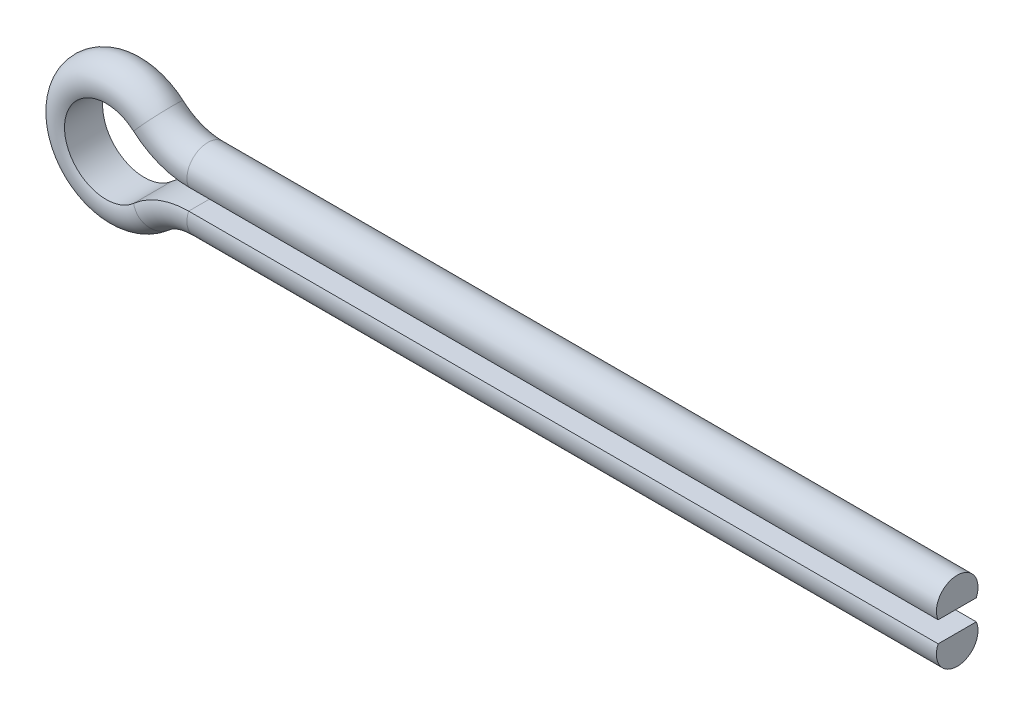
ISO-10303-21;
HEADER;
FILE_DESCRIPTION(('STEP AP214'),'2;1');
FILE_NAME('part.step','',(''),(''),'','','');
FILE_SCHEMA(('AUTOMOTIVE_DESIGN { 1 0 10303 214 1 1 1 1 }'));
ENDSEC;
DATA;
#1=APPLICATION_CONTEXT('core data for automotive mechanical design processes');
#2=APPLICATION_PROTOCOL_DEFINITION('international standard','automotive_design',2000,#1);
#3=PRODUCT_CONTEXT('',#1,'mechanical');
#4=PRODUCT('Part','Part','',(#3));
#5=PRODUCT_RELATED_PRODUCT_CATEGORY('part','',(#4));
#6=PRODUCT_DEFINITION_FORMATION('','',#4);
#7=PRODUCT_DEFINITION_CONTEXT('part definition',#1,'design');
#8=PRODUCT_DEFINITION('design','',#6,#7);
#9=PRODUCT_DEFINITION_SHAPE('','',#8);
#10=(LENGTH_UNIT() NAMED_UNIT(*) SI_UNIT(.MILLI.,.METRE.));
#11=(NAMED_UNIT(*) PLANE_ANGLE_UNIT() SI_UNIT($,.RADIAN.));
#12=(NAMED_UNIT(*) SI_UNIT($,.STERADIAN.) SOLID_ANGLE_UNIT());
#13=UNCERTAINTY_MEASURE_WITH_UNIT(LENGTH_MEASURE(1.E-05),#10,'distance_accuracy_value','');
#14=(GEOMETRIC_REPRESENTATION_CONTEXT(3) GLOBAL_UNCERTAINTY_ASSIGNED_CONTEXT((#13)) GLOBAL_UNIT_ASSIGNED_CONTEXT((#10,
#11,#12)) REPRESENTATION_CONTEXT('',''));
#15=CARTESIAN_POINT('',(0.,0.,0.));
#16=DIRECTION('',(0.,0.,1.));
#17=DIRECTION('',(1.,0.,0.));
#18=AXIS2_PLACEMENT_3D('',#15,#16,#17);
#19=CARTESIAN_POINT('',(100.,-2.25,0.));
#20=DIRECTION('',(-1.,0.,0.));
#21=DIRECTION('',(0.,-1.,0.));
#22=AXIS2_PLACEMENT_3D('',#19,#20,#21);
#23=PLANE('',#22);
#24=CARTESIAN_POINT('',(100.,-2.25,0.));
#25=DIRECTION('',(-1.,0.,0.));
#26=DIRECTION('',(0.,-1.,0.));
#27=AXIS2_PLACEMENT_3D('',#24,#25,#26);
#28=CIRCLE('',#27,2.5);
#29=CARTESIAN_POINT('',(100.,-1.25,-2.29128784747792));
#30=VERTEX_POINT('',#29);
#31=CARTESIAN_POINT('',(100.,-1.25,2.29128784747792));
#32=VERTEX_POINT('',#31);
#33=EDGE_CURVE('E79',#30,#32,#28,.T.);
#34=ORIENTED_EDGE('',*,*,#33,.F.);
#35=DIRECTION('',(0.,0.,-1.));
#36=VECTOR('',#35,1.);
#37=CARTESIAN_POINT('',(100.,-1.25,2.29128784747792));
#38=LINE('',#37,#36);
#39=EDGE_CURVE('E81',#32,#30,#38,.T.);
#40=ORIENTED_EDGE('',*,*,#39,.F.);
#41=EDGE_LOOP('',(#34,#40));
#42=FACE_BOUND('',#41,.T.);
#43=ADVANCED_FACE('F33',(#42),#23,.F.);
#44=CARTESIAN_POINT('',(100.,2.25,0.));
#45=DIRECTION('',(1.,0.,0.));
#46=DIRECTION('',(0.,1.,0.));
#47=AXIS2_PLACEMENT_3D('',#44,#45,#46);
#48=PLANE('',#47);
#49=CARTESIAN_POINT('',(100.,2.25,0.));
#50=DIRECTION('',(1.,0.,0.));
#51=DIRECTION('',(0.,1.,0.));
#52=AXIS2_PLACEMENT_3D('',#49,#50,#51);
#53=CIRCLE('',#52,2.5);
#54=CARTESIAN_POINT('',(100.,1.25,-2.29128784747792));
#55=VERTEX_POINT('',#54);
#56=CARTESIAN_POINT('',(100.,1.25,2.29128784747792));
#57=VERTEX_POINT('',#56);
#58=EDGE_CURVE('E45',#55,#57,#53,.T.);
#59=ORIENTED_EDGE('',*,*,#58,.T.);
#60=DIRECTION('',(0.,0.,-1.));
#61=VECTOR('',#60,1.);
#62=CARTESIAN_POINT('',(100.,1.25,2.29128784747792));
#63=LINE('',#62,#61);
#64=EDGE_CURVE('E11',#57,#55,#63,.T.);
#65=ORIENTED_EDGE('',*,*,#64,.T.);
#66=EDGE_LOOP('',(#59,#65));
#67=FACE_BOUND('',#66,.T.);
#68=ADVANCED_FACE('F184',(#67),#48,.T.);
#69=CARTESIAN_POINT('',(100.,-2.25,0.));
#70=DIRECTION('',(-1.,0.,0.));
#71=DIRECTION('',(0.,-1.,0.));
#72=AXIS2_PLACEMENT_3D('',#69,#70,#71);
#73=CYLINDRICAL_SURFACE('',#72,2.5);
#74=DIRECTION('',(-1.,0.,0.));
#75=VECTOR('',#74,1.);
#76=CARTESIAN_POINT('',(100.,-1.25,2.29128784747792));
#77=LINE('',#76,#75);
#78=CARTESIAN_POINT('',(9.92156741649222,-1.25,2.29128784747792));
#79=VERTEX_POINT('',#78);
#80=EDGE_CURVE('E92',#32,#79,#77,.T.);
#81=ORIENTED_EDGE('',*,*,#80,.T.);
#82=CARTESIAN_POINT('',(9.92156741649222,-2.25,0.));
#83=DIRECTION('',(-1.,0.,0.));
#84=DIRECTION('',(0.,-1.,0.));
#85=AXIS2_PLACEMENT_3D('',#82,#83,#84);
#86=CIRCLE('',#85,2.5);
#87=CARTESIAN_POINT('',(9.92156741649222,-1.25,-2.29128784747792));
#88=VERTEX_POINT('',#87);
#89=EDGE_CURVE('E97',#88,#79,#86,.T.);
#90=ORIENTED_EDGE('',*,*,#89,.F.);
#91=DIRECTION('',(-1.,0.,0.));
#92=VECTOR('',#91,1.);
#93=CARTESIAN_POINT('',(100.,-1.25,-2.29128784747792));
#94=LINE('',#93,#92);
#95=EDGE_CURVE('E91',#30,#88,#94,.T.);
#96=ORIENTED_EDGE('',*,*,#95,.F.);
#97=ORIENTED_EDGE('',*,*,#33,.T.);
#98=EDGE_LOOP('',(#81,#90,#96,#97));
#99=FACE_BOUND('',#98,.T.);
#100=ADVANCED_FACE('F95',(#99),#73,.T.);
#101=CARTESIAN_POINT('',(100.,-1.25,2.29128784747792));
#102=DIRECTION('',(0.,1.,0.));
#103=DIRECTION('',(-1.,0.,0.));
#104=AXIS2_PLACEMENT_3D('',#101,#102,#103);
#105=PLANE('',#104);
#106=DIRECTION('',(0.,0.,-1.));
#107=VECTOR('',#106,1.);
#108=CARTESIAN_POINT('',(9.92156741649222,-1.25,2.29128784747792));
#109=LINE('',#108,#107);
#110=EDGE_CURVE('E112',#79,#88,#109,.T.);
#111=ORIENTED_EDGE('',*,*,#110,.F.);
#112=ORIENTED_EDGE('',*,*,#80,.F.);
#113=ORIENTED_EDGE('',*,*,#39,.T.);
#114=ORIENTED_EDGE('',*,*,#95,.T.);
#115=EDGE_LOOP('',(#111,#112,#113,#114));
#116=FACE_BOUND('',#115,.T.);
#117=ADVANCED_FACE('F90',(#116),#105,.T.);
#118=CARTESIAN_POINT('',(9.92156741649221,-11.25,0.));
#119=DIRECTION('',(0.,0.,1.));
#120=DIRECTION('',(1.,0.,0.));
#121=AXIS2_PLACEMENT_3D('',#118,#119,#120);
#122=TOROIDAL_SURFACE('',#121,9.,2.5);
#123=CARTESIAN_POINT('',(9.92156741649221,-11.25,2.29128784747792));
#124=DIRECTION('',(0.,0.,1.));
#125=DIRECTION('',(0.,1.,0.));
#126=AXIS2_PLACEMENT_3D('',#123,#124,#125);
#127=CIRCLE('',#126,10.);
#128=CARTESIAN_POINT('',(3.30718913883073,-3.75000000000001,2.29128784747792));
#129=VERTEX_POINT('',#128);
#130=EDGE_CURVE('E105',#79,#129,#127,.T.);
#131=ORIENTED_EDGE('',*,*,#130,.T.);
#132=CARTESIAN_POINT('',(3.96862696659687,-4.5,0.));
#133=DIRECTION('',(-0.75,-0.661437827766148,0.));
#134=DIRECTION('',(0.661437827766148,-0.75,0.));
#135=AXIS2_PLACEMENT_3D('',#132,#133,#134);
#136=CIRCLE('',#135,2.5);
#137=CARTESIAN_POINT('',(3.30718913883073,-3.75000000000001,-2.29128784747792));
#138=VERTEX_POINT('',#137);
#139=EDGE_CURVE('E102',#138,#129,#136,.T.);
#140=ORIENTED_EDGE('',*,*,#139,.F.);
#141=CARTESIAN_POINT('',(9.92156741649221,-11.25,-2.29128784747792));
#142=DIRECTION('',(0.,0.,1.));
#143=DIRECTION('',(0.,1.,0.));
#144=AXIS2_PLACEMENT_3D('',#141,#142,#143);
#145=CIRCLE('',#144,10.);
#146=EDGE_CURVE('E106',#88,#138,#145,.T.);
#147=ORIENTED_EDGE('',*,*,#146,.F.);
#148=ORIENTED_EDGE('',*,*,#89,.T.);
#149=EDGE_LOOP('',(#131,#140,#147,#148));
#150=FACE_BOUND('',#149,.T.);
#151=ADVANCED_FACE('F164',(#150),#122,.T.);
#152=CARTESIAN_POINT('',(9.92156741649221,-11.25,0.));
#153=DIRECTION('',(0.,0.,1.));
#154=DIRECTION('',(1.,0.,0.));
#155=AXIS2_PLACEMENT_3D('',#152,#153,#154);
#156=CYLINDRICAL_SURFACE('',#155,10.);
#157=DIRECTION('',(0.,0.,-1.));
#158=VECTOR('',#157,1.);
#159=CARTESIAN_POINT('',(3.30718913883073,-3.75,2.29128784747792));
#160=LINE('',#159,#158);
#161=EDGE_CURVE('E109',#129,#138,#160,.T.);
#162=ORIENTED_EDGE('',*,*,#161,.F.);
#163=ORIENTED_EDGE('',*,*,#130,.F.);
#164=ORIENTED_EDGE('',*,*,#110,.T.);
#165=ORIENTED_EDGE('',*,*,#146,.T.);
#166=EDGE_LOOP('',(#162,#163,#164,#165));
#167=FACE_BOUND('',#166,.T.);
#168=ADVANCED_FACE('F165',(#167),#156,.T.);
#169=CARTESIAN_POINT('',(0.,0.,0.));
#170=DIRECTION('',(0.,0.,-1.));
#171=DIRECTION('',(-1.,0.,0.));
#172=AXIS2_PLACEMENT_3D('',#169,#170,#171);
#173=TOROIDAL_SURFACE('',#172,5.99999999999999,2.5);
#174=CARTESIAN_POINT('',(0.,0.,2.29128784747792));
#175=DIRECTION('',(0.,0.,-1.));
#176=DIRECTION('',(0.661437827766149,-0.749999999999999,0.));
#177=AXIS2_PLACEMENT_3D('',#174,#175,#176);
#178=CIRCLE('',#177,4.99999999999999);
#179=CARTESIAN_POINT('',(3.30718913883072,3.75,2.29128784747792));
#180=VERTEX_POINT('',#179);
#181=EDGE_CURVE('E116',#129,#180,#178,.T.);
#182=ORIENTED_EDGE('',*,*,#181,.T.);
#183=CARTESIAN_POINT('',(3.96862696659689,4.5,0.));
#184=DIRECTION('',(0.749999999999999,-0.661437827766148,0.));
#185=DIRECTION('',(0.661437827766149,0.749999999999999,0.));
#186=AXIS2_PLACEMENT_3D('',#183,#184,#185);
#187=CIRCLE('',#186,2.5);
#188=CARTESIAN_POINT('',(3.30718913883072,3.75,-2.29128784747792));
#189=VERTEX_POINT('',#188);
#190=EDGE_CURVE('E113',#189,#180,#187,.T.);
#191=ORIENTED_EDGE('',*,*,#190,.F.);
#192=CARTESIAN_POINT('',(0.,0.,-2.29128784747792));
#193=DIRECTION('',(0.,0.,-1.));
#194=DIRECTION('',(0.661437827766149,-0.749999999999999,0.));
#195=AXIS2_PLACEMENT_3D('',#192,#193,#194);
#196=CIRCLE('',#195,4.99999999999999);
#197=EDGE_CURVE('E117',#138,#189,#196,.T.);
#198=ORIENTED_EDGE('',*,*,#197,.F.);
#199=ORIENTED_EDGE('',*,*,#139,.T.);
#200=EDGE_LOOP('',(#182,#191,#198,#199));
#201=FACE_BOUND('',#200,.T.);
#202=ADVANCED_FACE('F158',(#201),#173,.T.);
#203=CARTESIAN_POINT('',(0.,0.,0.));
#204=DIRECTION('',(0.,0.,-1.));
#205=DIRECTION('',(-1.,0.,0.));
#206=AXIS2_PLACEMENT_3D('',#203,#204,#205);
#207=CYLINDRICAL_SURFACE('',#206,4.99999999999999);
#208=DIRECTION('',(0.,0.,-1.));
#209=VECTOR('',#208,1.);
#210=CARTESIAN_POINT('',(3.30718913883073,3.75,2.29128784747792));
#211=LINE('',#210,#209);
#212=EDGE_CURVE('E120',#180,#189,#211,.T.);
#213=ORIENTED_EDGE('',*,*,#212,.F.);
#214=ORIENTED_EDGE('',*,*,#181,.F.);
#215=ORIENTED_EDGE('',*,*,#161,.T.);
#216=ORIENTED_EDGE('',*,*,#197,.T.);
#217=EDGE_LOOP('',(#213,#214,#215,#216));
#218=FACE_BOUND('',#217,.T.);
#219=ADVANCED_FACE('F159',(#218),#207,.F.);
#220=CARTESIAN_POINT('',(9.92156741649221,11.25,0.));
#221=DIRECTION('',(0.,0.,1.));
#222=DIRECTION('',(1.,0.,0.));
#223=AXIS2_PLACEMENT_3D('',#220,#221,#222);
#224=TOROIDAL_SURFACE('',#223,9.00000000000002,2.5);
#225=CARTESIAN_POINT('',(9.92156741649221,11.25,2.29128784747792));
#226=DIRECTION('',(0.,0.,1.));
#227=DIRECTION('',(-0.661437827766146,-0.750000000000001,0.));
#228=AXIS2_PLACEMENT_3D('',#225,#226,#227);
#229=CIRCLE('',#228,10.);
#230=CARTESIAN_POINT('',(9.92156741649222,1.24999999999998,2.29128784747792));
#231=VERTEX_POINT('',#230);
#232=EDGE_CURVE('E126',#180,#231,#229,.T.);
#233=ORIENTED_EDGE('',*,*,#232,.T.);
#234=CARTESIAN_POINT('',(9.92156741649222,2.25,0.));
#235=DIRECTION('',(1.,0.,0.));
#236=DIRECTION('',(0.,1.,0.));
#237=AXIS2_PLACEMENT_3D('',#234,#235,#236);
#238=CIRCLE('',#237,2.5);
#239=CARTESIAN_POINT('',(9.92156741649222,1.24999999999998,-2.29128784747792));
#240=VERTEX_POINT('',#239);
#241=EDGE_CURVE('E123',#240,#231,#238,.T.);
#242=ORIENTED_EDGE('',*,*,#241,.F.);
#243=CARTESIAN_POINT('',(9.92156741649221,11.25,-2.29128784747792));
#244=DIRECTION('',(0.,0.,1.));
#245=DIRECTION('',(-0.661437827766146,-0.750000000000001,0.));
#246=AXIS2_PLACEMENT_3D('',#243,#244,#245);
#247=CIRCLE('',#246,10.);
#248=EDGE_CURVE('E127',#189,#240,#247,.T.);
#249=ORIENTED_EDGE('',*,*,#248,.F.);
#250=ORIENTED_EDGE('',*,*,#190,.T.);
#251=EDGE_LOOP('',(#233,#242,#249,#250));
#252=FACE_BOUND('',#251,.T.);
#253=ADVANCED_FACE('F151',(#252),#224,.T.);
#254=CARTESIAN_POINT('',(9.92156741649221,11.25,0.));
#255=DIRECTION('',(0.,0.,1.));
#256=DIRECTION('',(1.,0.,0.));
#257=AXIS2_PLACEMENT_3D('',#254,#255,#256);
#258=CYLINDRICAL_SURFACE('',#257,10.);
#259=DIRECTION('',(0.,0.,-1.));
#260=VECTOR('',#259,1.);
#261=CARTESIAN_POINT('',(9.92156741649222,1.25,2.29128784747792));
#262=LINE('',#261,#260);
#263=EDGE_CURVE('E130',#231,#240,#262,.T.);
#264=ORIENTED_EDGE('',*,*,#263,.F.);
#265=ORIENTED_EDGE('',*,*,#232,.F.);
#266=ORIENTED_EDGE('',*,*,#212,.T.);
#267=ORIENTED_EDGE('',*,*,#248,.T.);
#268=EDGE_LOOP('',(#264,#265,#266,#267));
#269=FACE_BOUND('',#268,.T.);
#270=ADVANCED_FACE('F153',(#269),#258,.T.);
#271=CARTESIAN_POINT('',(9.92156741649222,2.25,0.));
#272=DIRECTION('',(1.,0.,0.));
#273=DIRECTION('',(0.,1.,0.));
#274=AXIS2_PLACEMENT_3D('',#271,#272,#273);
#275=CYLINDRICAL_SURFACE('',#274,2.5);
#276=DIRECTION('',(1.,0.,0.));
#277=VECTOR('',#276,1.);
#278=CARTESIAN_POINT('',(9.92156741649222,1.25,2.29128784747792));
#279=LINE('',#278,#277);
#280=EDGE_CURVE('E40',#231,#57,#279,.T.);
#281=ORIENTED_EDGE('',*,*,#280,.T.);
#282=ORIENTED_EDGE('',*,*,#58,.F.);
#283=DIRECTION('',(1.,0.,0.));
#284=VECTOR('',#283,1.);
#285=CARTESIAN_POINT('',(9.92156741649222,1.25,-2.29128784747792));
#286=LINE('',#285,#284);
#287=EDGE_CURVE('E134',#240,#55,#286,.T.);
#288=ORIENTED_EDGE('',*,*,#287,.F.);
#289=ORIENTED_EDGE('',*,*,#241,.T.);
#290=EDGE_LOOP('',(#281,#282,#288,#289));
#291=FACE_BOUND('',#290,.T.);
#292=ADVANCED_FACE('F177',(#291),#275,.T.);
#293=CARTESIAN_POINT('',(9.92156741649222,1.25,2.29128784747792));
#294=DIRECTION('',(0.,-1.,0.));
#295=DIRECTION('',(1.,0.,0.));
#296=AXIS2_PLACEMENT_3D('',#293,#294,#295);
#297=PLANE('',#296);
#298=ORIENTED_EDGE('',*,*,#64,.F.);
#299=ORIENTED_EDGE('',*,*,#280,.F.);
#300=ORIENTED_EDGE('',*,*,#263,.T.);
#301=ORIENTED_EDGE('',*,*,#287,.T.);
#302=EDGE_LOOP('',(#298,#299,#300,#301));
#303=FACE_BOUND('',#302,.T.);
#304=ADVANCED_FACE('F148',(#303),#297,.T.);
#305=CLOSED_SHELL('',(#43,#68,#100,#117,#151,#168,#202,#219,#253,#270,#292,#304));
#306=MANIFOLD_SOLID_BREP('B2',#305);
#307=ADVANCED_BREP_SHAPE_REPRESENTATION('',(#18,#306),#14);
#308=SHAPE_DEFINITION_REPRESENTATION(#9,#307);
ENDSEC;
END-ISO-10303-21;
